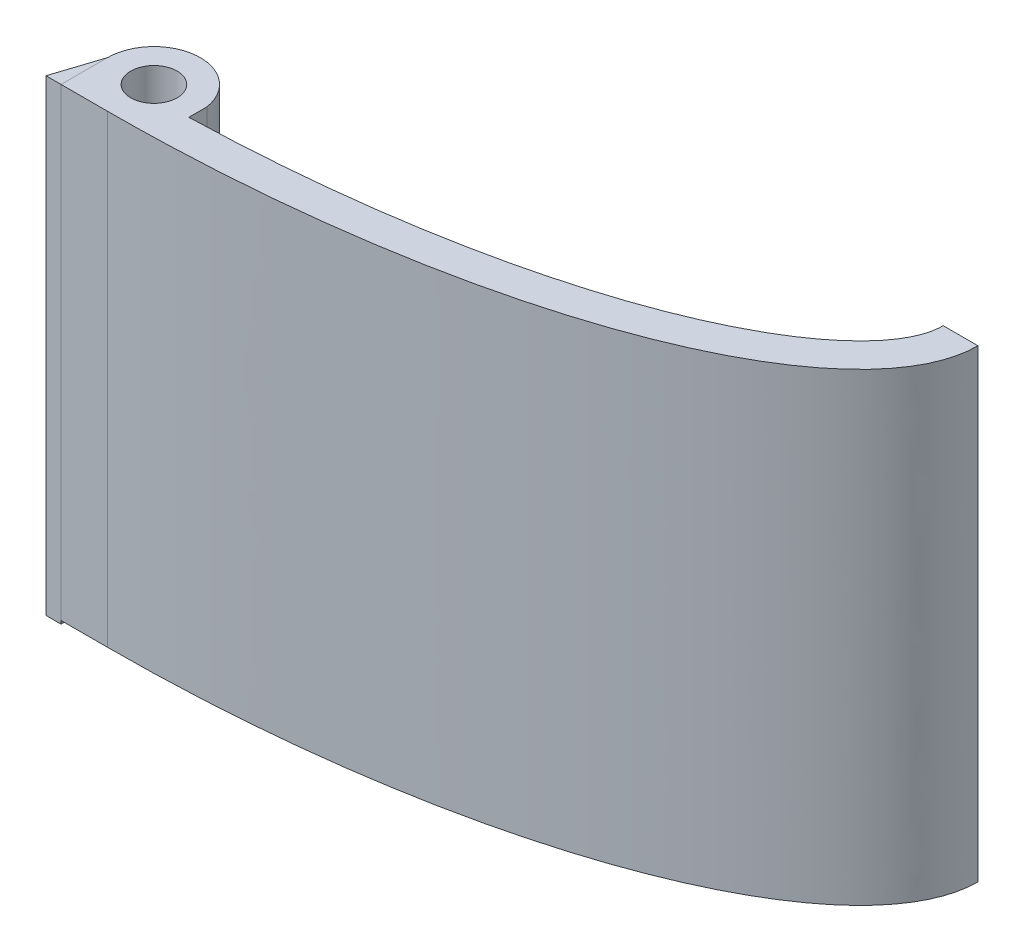
ISO-10303-21;
HEADER;
FILE_DESCRIPTION(('STEP AP214'),'2;1');
FILE_NAME('part.step','',(''),(''),'','','');
FILE_SCHEMA(('AUTOMOTIVE_DESIGN { 1 0 10303 214 1 1 1 1 }'));
ENDSEC;
DATA;
#1=APPLICATION_CONTEXT('core data for automotive mechanical design processes');
#2=APPLICATION_PROTOCOL_DEFINITION('international standard','automotive_design',2000,#1);
#3=PRODUCT_CONTEXT('',#1,'mechanical');
#4=PRODUCT('Part','Part','',(#3));
#5=PRODUCT_RELATED_PRODUCT_CATEGORY('part','',(#4));
#6=PRODUCT_DEFINITION_FORMATION('','',#4);
#7=PRODUCT_DEFINITION_CONTEXT('part definition',#1,'design');
#8=PRODUCT_DEFINITION('design','',#6,#7);
#9=PRODUCT_DEFINITION_SHAPE('','',#8);
#10=(LENGTH_UNIT() NAMED_UNIT(*) SI_UNIT(.MILLI.,.METRE.));
#11=(NAMED_UNIT(*) PLANE_ANGLE_UNIT() SI_UNIT($,.RADIAN.));
#12=(NAMED_UNIT(*) SI_UNIT($,.STERADIAN.) SOLID_ANGLE_UNIT());
#13=UNCERTAINTY_MEASURE_WITH_UNIT(LENGTH_MEASURE(1.E-05),#10,'distance_accuracy_value','');
#14=(GEOMETRIC_REPRESENTATION_CONTEXT(3) GLOBAL_UNCERTAINTY_ASSIGNED_CONTEXT((#13)) GLOBAL_UNIT_ASSIGNED_CONTEXT((#10,
#11,#12)) REPRESENTATION_CONTEXT('',''));
#15=CARTESIAN_POINT('',(0.,0.,0.));
#16=DIRECTION('',(0.,0.,1.));
#17=DIRECTION('',(1.,0.,0.));
#18=AXIS2_PLACEMENT_3D('',#15,#16,#17);
#19=CARTESIAN_POINT('',(16.,-0.275000000000004,30.));
#20=DIRECTION('',(1.,0.,0.));
#21=DIRECTION('',(0.,0.,-1.));
#22=AXIS2_PLACEMENT_3D('',#19,#20,#21);
#23=PLANE('',#22);
#24=DIRECTION('',(0.,0.,-1.));
#25=VECTOR('',#24,1.);
#26=CARTESIAN_POINT('',(16.,40.,30.));
#27=LINE('',#26,#25);
#28=CARTESIAN_POINT('',(16.,40.,30.));
#29=VERTEX_POINT('',#28);
#30=CARTESIAN_POINT('',(16.,40.,26.));
#31=VERTEX_POINT('',#30);
#32=EDGE_CURVE('E96',#29,#31,#27,.T.);
#33=ORIENTED_EDGE('',*,*,#32,.F.);
#34=DIRECTION('',(0.,1.,0.));
#35=VECTOR('',#34,1.);
#36=CARTESIAN_POINT('',(16.,-0.275000000000004,30.));
#37=LINE('',#36,#35);
#38=CARTESIAN_POINT('',(16.,-0.275000000000004,30.));
#39=VERTEX_POINT('',#38);
#40=EDGE_CURVE('E12',#39,#29,#37,.T.);
#41=ORIENTED_EDGE('',*,*,#40,.F.);
#42=DIRECTION('',(0.,0.,-1.));
#43=VECTOR('',#42,1.);
#44=CARTESIAN_POINT('',(16.,-0.275000000000004,30.));
#45=LINE('',#44,#43);
#46=CARTESIAN_POINT('',(16.,-0.275000000000004,26.));
#47=VERTEX_POINT('',#46);
#48=EDGE_CURVE('E88',#39,#47,#45,.T.);
#49=ORIENTED_EDGE('',*,*,#48,.T.);
#50=DIRECTION('',(0.,1.,0.));
#51=VECTOR('',#50,1.);
#52=CARTESIAN_POINT('',(16.,-0.275000000000004,26.));
#53=LINE('',#52,#51);
#54=EDGE_CURVE('E47',#47,#31,#53,.T.);
#55=ORIENTED_EDGE('',*,*,#54,.T.);
#56=EDGE_LOOP('',(#33,#41,#49,#55));
#57=FACE_BOUND('',#56,.T.);
#58=ADVANCED_FACE('F44',(#57),#23,.T.);
#59=CARTESIAN_POINT('',(16.,-0.275000000000004,30.));
#60=DIRECTION('',(0.,0.,1.));
#61=DIRECTION('',(1.,0.,0.));
#62=AXIS2_PLACEMENT_3D('',#59,#60,#61);
#63=PLANE('',#62);
#64=DIRECTION('',(1.,0.,0.));
#65=VECTOR('',#64,1.);
#66=CARTESIAN_POINT('',(16.,40.,30.));
#67=LINE('',#66,#65);
#68=CARTESIAN_POINT('',(14.7,40.,30.));
#69=VERTEX_POINT('',#68);
#70=EDGE_CURVE('E90',#69,#29,#67,.T.);
#71=ORIENTED_EDGE('',*,*,#70,.F.);
#72=DIRECTION('',(0.,1.,0.));
#73=VECTOR('',#72,1.);
#74=CARTESIAN_POINT('',(14.7,-0.275000000000004,30.));
#75=LINE('',#74,#73);
#76=CARTESIAN_POINT('',(14.7,-0.275000000000004,30.));
#77=VERTEX_POINT('',#76);
#78=EDGE_CURVE('E53',#77,#69,#75,.T.);
#79=ORIENTED_EDGE('',*,*,#78,.F.);
#80=DIRECTION('',(1.,0.,0.));
#81=VECTOR('',#80,1.);
#82=CARTESIAN_POINT('',(16.,-0.275000000000004,30.));
#83=LINE('',#82,#81);
#84=EDGE_CURVE('E85',#77,#39,#83,.T.);
#85=ORIENTED_EDGE('',*,*,#84,.T.);
#86=ORIENTED_EDGE('',*,*,#40,.T.);
#87=EDGE_LOOP('',(#71,#79,#85,#86));
#88=FACE_BOUND('',#87,.T.);
#89=ADVANCED_FACE('F100',(#88),#63,.T.);
#90=CARTESIAN_POINT('',(14.7,-0.275000000000004,30.));
#91=DIRECTION('',(-0.951034068730948,0.,-0.309086072337558));
#92=DIRECTION('',(-0.309086072337558,0.,0.951034068730948));
#93=AXIS2_PLACEMENT_3D('',#90,#91,#92);
#94=PLANE('',#93);
#95=DIRECTION('',(-0.309086072337558,0.,0.951034068730948));
#96=VECTOR('',#95,1.);
#97=CARTESIAN_POINT('',(14.7,40.,30.));
#98=LINE('',#97,#96);
#99=EDGE_CURVE('E83',#31,#69,#98,.T.);
#100=ORIENTED_EDGE('',*,*,#99,.F.);
#101=ORIENTED_EDGE('',*,*,#54,.F.);
#102=DIRECTION('',(-0.309086072337558,0.,0.951034068730948));
#103=VECTOR('',#102,1.);
#104=CARTESIAN_POINT('',(14.7,-0.275000000000004,30.));
#105=LINE('',#104,#103);
#106=EDGE_CURVE('E81',#47,#77,#105,.T.);
#107=ORIENTED_EDGE('',*,*,#106,.T.);
#108=ORIENTED_EDGE('',*,*,#78,.T.);
#109=EDGE_LOOP('',(#100,#101,#107,#108));
#110=FACE_BOUND('',#109,.T.);
#111=ADVANCED_FACE('F80',(#110),#94,.T.);
#112=CARTESIAN_POINT('',(0.,-0.275000000000004,0.));
#113=DIRECTION('',(0.,1.,0.));
#114=DIRECTION('',(0.,0.,1.));
#115=AXIS2_PLACEMENT_3D('',#112,#113,#114);
#116=PLANE('',#115);
#117=ORIENTED_EDGE('',*,*,#48,.F.);
#118=ORIENTED_EDGE('',*,*,#84,.F.);
#119=ORIENTED_EDGE('',*,*,#106,.F.);
#120=EDGE_LOOP('',(#117,#118,#119));
#121=FACE_BOUND('',#120,.T.);
#122=ADVANCED_FACE('F87',(#121),#116,.F.);
#123=CARTESIAN_POINT('',(0.,40.,0.));
#124=DIRECTION('',(0.,1.,0.));
#125=DIRECTION('',(0.,0.,1.));
#126=AXIS2_PLACEMENT_3D('',#123,#124,#125);
#127=PLANE('',#126);
#128=ORIENTED_EDGE('',*,*,#32,.T.);
#129=ORIENTED_EDGE('',*,*,#99,.T.);
#130=ORIENTED_EDGE('',*,*,#70,.T.);
#131=EDGE_LOOP('',(#128,#129,#130));
#132=FACE_BOUND('',#131,.T.);
#133=ADVANCED_FACE('F99',(#132),#127,.T.);
#134=CLOSED_SHELL('',(#58,#89,#111,#122,#133));
#135=MANIFOLD_SOLID_BREP('B2',#134);
#136=CARTESIAN_POINT('',(20.,-0.285000000000007,27.));
#137=CARTESIAN_POINT('',(25.15393605695,-0.285000000000007,27.));
#138=CARTESIAN_POINT('',(30.1975323268545,-0.285000000000007,26.7368136416308));
#139=CARTESIAN_POINT('',(35.1515107397377,-0.285000000000007,26.2095124751268));
#140=CARTESIAN_POINT('',(35.1738230679321,-0.285000000000007,26.2071327106288));
#141=CARTESIAN_POINT('',(35.2153941000412,-0.285000000000007,26.2026885265985));
#142=CARTESIAN_POINT('',(35.2777331713868,-0.285000000000007,26.1960095868543));
#143=CARTESIAN_POINT('',(35.423068663912,-0.285000000000007,26.1803367549963));
#144=CARTESIAN_POINT('',(35.7132502634823,-0.285000000000007,26.1486365891192));
#145=CARTESIAN_POINT('',(36.2916557378931,-0.285000000000007,26.083818686069));
#146=CARTESIAN_POINT('',(37.4406343488846,-0.285000000000007,25.9485161377419));
#147=CARTESIAN_POINT('',(39.707251145241,-0.285000000000007,25.6552731282619));
#148=CARTESIAN_POINT('',(41.5963017967152,-0.285000000000007,25.3652161814251));
#149=CARTESIAN_POINT('',(45.3026413819253,-0.285000000000007,24.7337975819237));
#150=CARTESIAN_POINT('',(47.6778365502934,-0.285000000000007,24.2444346767416));
#151=CARTESIAN_POINT('',(49.96618026701,-0.285000000000007,23.6854238211354));
#152=CARTESIAN_POINT('',(49.9791403612718,-0.285000000000007,23.6822557851479));
#153=CARTESIAN_POINT('',(50.0009935779683,-0.285000000000007,23.6769090919129));
#154=CARTESIAN_POINT('',(50.0337624641158,-0.285000000000007,23.6688855345803));
#155=CARTESIAN_POINT('',(50.1101466224485,-0.285000000000007,23.6501392837315));
#156=CARTESIAN_POINT('',(50.2626086052154,-0.285000000000007,23.6125483562067));
#157=CARTESIAN_POINT('',(50.5663069960969,-0.285000000000007,23.5369731401424));
#158=CARTESIAN_POINT('',(51.1687995637805,-0.285000000000007,23.3842520444948));
#159=CARTESIAN_POINT('',(52.3541524979884,-0.285000000000007,23.0725501494248));
#160=CARTESIAN_POINT('',(53.3364610156703,-0.285000000000007,22.7947269015489));
#161=CARTESIAN_POINT('',(55.2559929991906,-0.285000000000007,22.2251276123408));
#162=CARTESIAN_POINT('',(56.4755634499144,-0.285000000000007,21.8267759589469));
#163=CARTESIAN_POINT('',(59.9528782257426,-0.285000000000007,20.5783379629899));
#164=CARTESIAN_POINT('',(62.0289488645667,-0.285000000000007,19.6745779455732));
#165=CARTESIAN_POINT('',(63.8655392335619,-0.285000000000007,18.7072429560843));
#166=CARTESIAN_POINT('',(63.8715390787882,-0.285000000000007,18.7040815106017));
#167=CARTESIAN_POINT('',(63.8811125542092,-0.285000000000007,18.699033876098));
#168=CARTESIAN_POINT('',(63.89546629926,-0.285000000000007,18.6914618789661));
#169=CARTESIAN_POINT('',(63.9289130925846,-0.285000000000007,18.673790076228));
#170=CARTESIAN_POINT('',(63.9956255503256,-0.285000000000007,18.638431298872));
#171=CARTESIAN_POINT('',(64.1283258312012,-0.285000000000007,18.5676535865955));
#172=CARTESIAN_POINT('',(64.3908269293376,-0.285000000000007,18.4258618234274));
#173=CARTESIAN_POINT('',(64.6108542569676,-0.285000000000007,18.3039357645735));
#174=CARTESIAN_POINT('',(65.0442704072598,-0.285000000000007,18.0596052420019));
#175=CARTESIAN_POINT('',(65.3243624975748,-0.285000000000007,17.8960794879705));
#176=CARTESIAN_POINT('',(66.1380473617355,-0.285000000000007,17.4039523576473));
#177=CARTESIAN_POINT('',(66.6450309885334,-0.285000000000007,17.0737876082818));
#178=CARTESIAN_POINT('',(68.0597752546771,-0.285000000000007,16.0804789135652));
#179=CARTESIAN_POINT('',(68.8607211181235,-0.285000000000007,15.4144860522358));
#180=CARTESIAN_POINT('',(69.527711762691,-0.285000000000007,14.7529909883076));
#181=CARTESIAN_POINT('',(69.5323913442827,-0.285000000000007,14.7483462096768));
#182=CARTESIAN_POINT('',(69.5396524970483,-0.285000000000007,14.7411298773372));
#183=CARTESIAN_POINT('',(69.5505305044692,-0.285000000000007,14.7303077386776));
#184=CARTESIAN_POINT('',(69.575816499988,-0.285000000000007,14.705072659651));
#185=CARTESIAN_POINT('',(69.6260046502194,-0.285000000000007,14.6546692845492));
#186=CARTESIAN_POINT('',(69.7248476213654,-0.285000000000007,14.5541334428662));
#187=CARTESIAN_POINT('',(69.806948776203,-0.285000000000007,14.4684372666596));
#188=CARTESIAN_POINT('',(69.967677802851,-0.285000000000007,14.2977161355929));
#189=CARTESIAN_POINT('',(70.0701982631017,-0.285000000000007,14.1847971878831));
#190=CARTESIAN_POINT('',(70.3640784725089,-0.285000000000007,13.8490001801885));
#191=CARTESIAN_POINT('',(70.541734895208,-0.285000000000007,13.6290919822721));
#192=CARTESIAN_POINT('',(71.0223694031363,-0.285000000000007,12.9832180086081));
#193=CARTESIAN_POINT('',(71.2726751059899,-0.285000000000007,12.5716090379524));
#194=CARTESIAN_POINT('',(71.6546183247109,-0.285000000000007,11.7894420273645));
#195=CARTESIAN_POINT('',(71.7867798899808,-0.285000000000007,11.4192489810083));
#196=CARTESIAN_POINT('',(71.9591063251687,-0.285000000000007,10.7023598460622));
#197=CARTESIAN_POINT('',(72.,-0.285000000000007,10.3551118767143));
#198=CARTESIAN_POINT('',(72.,-0.285000000000007,9.99999999999996));
#199=B_SPLINE_CURVE_WITH_KNOTS('',3,(#136,#137,#138,#139,#140,#141,#142,#143,#144,#145,#146,
#147,#148,#149,#150,#151,#152,#153,#154,#155,#156,#157,#158,#159,#160,#161,#162,#163,#164,#165,
#166,#167,#168,#169,#170,#171,#172,#173,#174,#175,#176,#177,#178,#179,#180,#181,#182,#183,#184,
#185,#186,#187,#188,#189,#190,#191,#192,#193,#194,#195,#196,#197,#198),.UNSPECIFIED.,.F.,.F.,(4,
2,2,1,1,1,1,1,1,2,2,2,1,1,1,1,1,1,2,2,2,2,1,1,1,1,1,2,2,2,2,2,1,1,1,1,2,2,2,2,2,4),(0.,
0.250000000000003,0.250976562500003,0.251953125000003,0.253906250000003,0.257812500000004,
0.265625000000006,0.281250000000009,0.312500000000016,0.375000000000028,0.500000000000054,
0.500488281250054,0.500976562500055,0.501953125000055,0.503906250000056,0.507812500000059,
0.515625000000064,0.531250000000073,0.562500000000093,0.625000000000132,0.75000000000021,
0.75024414062521,0.75048828125021,0.75097656250021,0.751953125000209,0.753906250000208,
0.757812500000204,0.765625000000197,0.781250000000181,0.812500000000151,0.875000000000091,
0.875244140625091,0.875488281250091,0.875976562500091,0.87695312500009,0.878906250000089,
0.882812500000086,0.89062500000008,0.906250000000069,0.937500000000046,0.968750000000023,1.),.UNSPECIFIED.);
#200=DIRECTION('',(0.,1.,0.));
#201=VECTOR('',#200,1.);
#202=SURFACE_OF_LINEAR_EXTRUSION('',#199,#201);
#203=CARTESIAN_POINT('',(20.,40.,27.));
#204=CARTESIAN_POINT('',(25.15393605695,40.,27.));
#205=CARTESIAN_POINT('',(30.1975323268545,40.,26.7368136416308));
#206=CARTESIAN_POINT('',(35.1515107397377,40.,26.2095124751268));
#207=CARTESIAN_POINT('',(35.1738230679321,40.,26.2071327106288));
#208=CARTESIAN_POINT('',(35.2153941000412,40.,26.2026885265985));
#209=CARTESIAN_POINT('',(35.2777331713868,40.,26.1960095868543));
#210=CARTESIAN_POINT('',(35.423068663912,40.,26.1803367549963));
#211=CARTESIAN_POINT('',(35.7132502634823,40.,26.1486365891192));
#212=CARTESIAN_POINT('',(36.2916557378931,40.,26.083818686069));
#213=CARTESIAN_POINT('',(37.4406343488846,40.,25.9485161377419));
#214=CARTESIAN_POINT('',(39.707251145241,40.,25.6552731282619));
#215=CARTESIAN_POINT('',(41.5963017967152,40.,25.3652161814251));
#216=CARTESIAN_POINT('',(45.3026413819253,40.,24.7337975819237));
#217=CARTESIAN_POINT('',(47.6778365502934,40.,24.2444346767416));
#218=CARTESIAN_POINT('',(49.96618026701,40.,23.6854238211354));
#219=CARTESIAN_POINT('',(49.9791403612718,40.,23.6822557851479));
#220=CARTESIAN_POINT('',(50.0009935779683,40.,23.6769090919129));
#221=CARTESIAN_POINT('',(50.0337624641158,40.,23.6688855345803));
#222=CARTESIAN_POINT('',(50.1101466224485,40.,23.6501392837315));
#223=CARTESIAN_POINT('',(50.2626086052154,40.,23.6125483562067));
#224=CARTESIAN_POINT('',(50.5663069960969,40.,23.5369731401424));
#225=CARTESIAN_POINT('',(51.1687995637805,40.,23.3842520444948));
#226=CARTESIAN_POINT('',(52.3541524979884,40.,23.0725501494248));
#227=CARTESIAN_POINT('',(53.3364610156703,40.,22.7947269015489));
#228=CARTESIAN_POINT('',(55.2559929991906,40.,22.2251276123408));
#229=CARTESIAN_POINT('',(56.4755634499144,40.,21.8267759589469));
#230=CARTESIAN_POINT('',(59.9528782257426,40.,20.5783379629899));
#231=CARTESIAN_POINT('',(62.0289488645667,40.,19.6745779455732));
#232=CARTESIAN_POINT('',(63.8655392335619,40.,18.7072429560843));
#233=CARTESIAN_POINT('',(63.8715390787882,40.,18.7040815106017));
#234=CARTESIAN_POINT('',(63.8811125542092,40.,18.699033876098));
#235=CARTESIAN_POINT('',(63.89546629926,40.,18.6914618789661));
#236=CARTESIAN_POINT('',(63.9289130925846,40.,18.673790076228));
#237=CARTESIAN_POINT('',(63.9956255503256,40.,18.638431298872));
#238=CARTESIAN_POINT('',(64.1283258312012,40.,18.5676535865955));
#239=CARTESIAN_POINT('',(64.3908269293376,40.,18.4258618234274));
#240=CARTESIAN_POINT('',(64.6108542569676,40.,18.3039357645735));
#241=CARTESIAN_POINT('',(65.0442704072598,40.,18.0596052420019));
#242=CARTESIAN_POINT('',(65.3243624975748,40.,17.8960794879705));
#243=CARTESIAN_POINT('',(66.1380473617355,40.,17.4039523576473));
#244=CARTESIAN_POINT('',(66.6450309885334,40.,17.0737876082818));
#245=CARTESIAN_POINT('',(68.0597752546771,40.,16.0804789135652));
#246=CARTESIAN_POINT('',(68.8607211181235,40.,15.4144860522358));
#247=CARTESIAN_POINT('',(69.527711762691,40.,14.7529909883076));
#248=CARTESIAN_POINT('',(69.5323913442827,40.,14.7483462096768));
#249=CARTESIAN_POINT('',(69.5396524970483,40.,14.7411298773372));
#250=CARTESIAN_POINT('',(69.5505305044692,40.,14.7303077386776));
#251=CARTESIAN_POINT('',(69.575816499988,40.,14.705072659651));
#252=CARTESIAN_POINT('',(69.6260046502194,40.,14.6546692845492));
#253=CARTESIAN_POINT('',(69.7248476213654,40.,14.5541334428662));
#254=CARTESIAN_POINT('',(69.806948776203,40.,14.4684372666596));
#255=CARTESIAN_POINT('',(69.967677802851,40.,14.2977161355929));
#256=CARTESIAN_POINT('',(70.0701982631017,40.,14.1847971878831));
#257=CARTESIAN_POINT('',(70.3640784725089,40.,13.8490001801885));
#258=CARTESIAN_POINT('',(70.541734895208,40.,13.6290919822721));
#259=CARTESIAN_POINT('',(71.0223694031363,40.,12.9832180086081));
#260=CARTESIAN_POINT('',(71.2726751059899,40.,12.5716090379524));
#261=CARTESIAN_POINT('',(71.6546183247109,40.,11.7894420273645));
#262=CARTESIAN_POINT('',(71.7867798899808,40.,11.4192489810083));
#263=CARTESIAN_POINT('',(71.9591063251687,40.,10.7023598460622));
#264=CARTESIAN_POINT('',(72.,40.,10.3551118767143));
#265=CARTESIAN_POINT('',(72.,40.,9.99999999999996));
#266=B_SPLINE_CURVE_WITH_KNOTS('',3,(#203,#204,#205,#206,#207,#208,#209,#210,#211,#212,#213,
#214,#215,#216,#217,#218,#219,#220,#221,#222,#223,#224,#225,#226,#227,#228,#229,#230,#231,#232,
#233,#234,#235,#236,#237,#238,#239,#240,#241,#242,#243,#244,#245,#246,#247,#248,#249,#250,#251,
#252,#253,#254,#255,#256,#257,#258,#259,#260,#261,#262,#263,#264,#265),.UNSPECIFIED.,.F.,.F.,(4,
2,2,1,1,1,1,1,1,2,2,2,1,1,1,1,1,1,2,2,2,2,1,1,1,1,1,2,2,2,2,2,1,1,1,1,2,2,2,2,2,4),(0.,
0.250000000000003,0.250976562500003,0.251953125000003,0.253906250000003,0.257812500000004,
0.265625000000006,0.281250000000009,0.312500000000016,0.375000000000028,0.500000000000054,
0.500488281250054,0.500976562500055,0.501953125000055,0.503906250000056,0.507812500000059,
0.515625000000064,0.531250000000073,0.562500000000093,0.625000000000132,0.75000000000021,
0.75024414062521,0.75048828125021,0.75097656250021,0.751953125000209,0.753906250000208,
0.757812500000204,0.765625000000197,0.781250000000181,0.812500000000151,0.875000000000091,
0.875244140625091,0.875488281250091,0.875976562500091,0.87695312500009,0.878906250000089,
0.882812500000086,0.89062500000008,0.906250000000069,0.937500000000046,0.968750000000023,1.),.UNSPECIFIED.);
#267=CARTESIAN_POINT('',(23.9545595077892,40.,26.9477974740407));
#268=VERTEX_POINT('',#267);
#269=CARTESIAN_POINT('',(72.,40.,9.99999999999996));
#270=VERTEX_POINT('',#269);
#271=EDGE_CURVE('E285',#268,#270,#266,.T.);
#272=ORIENTED_EDGE('',*,*,#271,.T.);
#273=DIRECTION('',(0.,1.,0.));
#274=VECTOR('',#273,1.);
#275=CARTESIAN_POINT('',(72.,-0.285000000000007,9.99999999999996));
#276=LINE('',#275,#274);
#277=CARTESIAN_POINT('',(72.,0.,9.99999999999996));
#278=VERTEX_POINT('',#277);
#279=EDGE_CURVE('E228',#278,#270,#276,.T.);
#280=ORIENTED_EDGE('',*,*,#279,.F.);
#281=CARTESIAN_POINT('',(20.,0.,27.));
#282=CARTESIAN_POINT('',(25.15393605695,0.,27.));
#283=CARTESIAN_POINT('',(30.1975323268545,0.,26.7368136416308));
#284=CARTESIAN_POINT('',(35.1515107397377,0.,26.2095124751268));
#285=CARTESIAN_POINT('',(35.1738230679321,0.,26.2071327106288));
#286=CARTESIAN_POINT('',(35.2153941000412,0.,26.2026885265985));
#287=CARTESIAN_POINT('',(35.2777331713868,0.,26.1960095868543));
#288=CARTESIAN_POINT('',(35.423068663912,0.,26.1803367549963));
#289=CARTESIAN_POINT('',(35.7132502634823,0.,26.1486365891192));
#290=CARTESIAN_POINT('',(36.2916557378931,0.,26.083818686069));
#291=CARTESIAN_POINT('',(37.4406343488846,0.,25.9485161377419));
#292=CARTESIAN_POINT('',(39.707251145241,0.,25.6552731282619));
#293=CARTESIAN_POINT('',(41.5963017967152,0.,25.3652161814251));
#294=CARTESIAN_POINT('',(45.3026413819253,0.,24.7337975819237));
#295=CARTESIAN_POINT('',(47.6778365502934,0.,24.2444346767416));
#296=CARTESIAN_POINT('',(49.96618026701,0.,23.6854238211354));
#297=CARTESIAN_POINT('',(49.9791403612718,0.,23.6822557851479));
#298=CARTESIAN_POINT('',(50.0009935779683,0.,23.6769090919129));
#299=CARTESIAN_POINT('',(50.0337624641158,0.,23.6688855345803));
#300=CARTESIAN_POINT('',(50.1101466224485,0.,23.6501392837315));
#301=CARTESIAN_POINT('',(50.2626086052154,0.,23.6125483562067));
#302=CARTESIAN_POINT('',(50.5663069960969,0.,23.5369731401424));
#303=CARTESIAN_POINT('',(51.1687995637805,0.,23.3842520444948));
#304=CARTESIAN_POINT('',(52.3541524979884,0.,23.0725501494248));
#305=CARTESIAN_POINT('',(53.3364610156703,0.,22.7947269015489));
#306=CARTESIAN_POINT('',(55.2559929991906,0.,22.2251276123408));
#307=CARTESIAN_POINT('',(56.4755634499144,0.,21.8267759589469));
#308=CARTESIAN_POINT('',(59.9528782257426,0.,20.5783379629899));
#309=CARTESIAN_POINT('',(62.0289488645667,0.,19.6745779455732));
#310=CARTESIAN_POINT('',(63.8655392335619,0.,18.7072429560843));
#311=CARTESIAN_POINT('',(63.8715390787882,0.,18.7040815106017));
#312=CARTESIAN_POINT('',(63.8811125542092,0.,18.699033876098));
#313=CARTESIAN_POINT('',(63.89546629926,0.,18.6914618789661));
#314=CARTESIAN_POINT('',(63.9289130925846,0.,18.673790076228));
#315=CARTESIAN_POINT('',(63.9956255503256,0.,18.638431298872));
#316=CARTESIAN_POINT('',(64.1283258312012,0.,18.5676535865955));
#317=CARTESIAN_POINT('',(64.3908269293376,0.,18.4258618234274));
#318=CARTESIAN_POINT('',(64.6108542569676,0.,18.3039357645735));
#319=CARTESIAN_POINT('',(65.0442704072598,0.,18.0596052420019));
#320=CARTESIAN_POINT('',(65.3243624975748,0.,17.8960794879705));
#321=CARTESIAN_POINT('',(66.1380473617355,0.,17.4039523576473));
#322=CARTESIAN_POINT('',(66.6450309885334,0.,17.0737876082818));
#323=CARTESIAN_POINT('',(68.0597752546771,0.,16.0804789135652));
#324=CARTESIAN_POINT('',(68.8607211181235,0.,15.4144860522358));
#325=CARTESIAN_POINT('',(69.527711762691,0.,14.7529909883076));
#326=CARTESIAN_POINT('',(69.5323913442827,0.,14.7483462096768));
#327=CARTESIAN_POINT('',(69.5396524970483,0.,14.7411298773372));
#328=CARTESIAN_POINT('',(69.5505305044692,0.,14.7303077386776));
#329=CARTESIAN_POINT('',(69.575816499988,0.,14.705072659651));
#330=CARTESIAN_POINT('',(69.6260046502194,0.,14.6546692845492));
#331=CARTESIAN_POINT('',(69.7248476213654,0.,14.5541334428662));
#332=CARTESIAN_POINT('',(69.806948776203,0.,14.4684372666596));
#333=CARTESIAN_POINT('',(69.967677802851,0.,14.2977161355929));
#334=CARTESIAN_POINT('',(70.0701982631017,0.,14.1847971878831));
#335=CARTESIAN_POINT('',(70.3640784725089,0.,13.8490001801885));
#336=CARTESIAN_POINT('',(70.541734895208,0.,13.6290919822721));
#337=CARTESIAN_POINT('',(71.0223694031363,0.,12.9832180086081));
#338=CARTESIAN_POINT('',(71.2726751059899,0.,12.5716090379524));
#339=CARTESIAN_POINT('',(71.6546183247109,0.,11.7894420273645));
#340=CARTESIAN_POINT('',(71.7867798899808,0.,11.4192489810083));
#341=CARTESIAN_POINT('',(71.9591063251687,0.,10.7023598460622));
#342=CARTESIAN_POINT('',(72.,0.,10.3551118767143));
#343=CARTESIAN_POINT('',(72.,0.,9.99999999999996));
#344=B_SPLINE_CURVE_WITH_KNOTS('',3,(#281,#282,#283,#284,#285,#286,#287,#288,#289,#290,#291,
#292,#293,#294,#295,#296,#297,#298,#299,#300,#301,#302,#303,#304,#305,#306,#307,#308,#309,#310,
#311,#312,#313,#314,#315,#316,#317,#318,#319,#320,#321,#322,#323,#324,#325,#326,#327,#328,#329,
#330,#331,#332,#333,#334,#335,#336,#337,#338,#339,#340,#341,#342,#343),.UNSPECIFIED.,.F.,.F.,(4,
2,2,1,1,1,1,1,1,2,2,2,1,1,1,1,1,1,2,2,2,2,1,1,1,1,1,2,2,2,2,2,1,1,1,1,2,2,2,2,2,4),(0.,
0.250000000000003,0.250976562500003,0.251953125000003,0.253906250000003,0.257812500000004,
0.265625000000006,0.281250000000009,0.312500000000016,0.375000000000028,0.500000000000054,
0.500488281250054,0.500976562500055,0.501953125000055,0.503906250000056,0.507812500000059,
0.515625000000064,0.531250000000073,0.562500000000093,0.625000000000132,0.75000000000021,
0.75024414062521,0.75048828125021,0.75097656250021,0.751953125000209,0.753906250000208,
0.757812500000204,0.765625000000197,0.781250000000181,0.812500000000151,0.875000000000091,
0.875244140625091,0.875488281250091,0.875976562500091,0.87695312500009,0.878906250000089,
0.882812500000086,0.89062500000008,0.906250000000069,0.937500000000046,0.968750000000023,1.),.UNSPECIFIED.);
#345=CARTESIAN_POINT('',(23.9545595077892,0.,26.9477974740407));
#346=VERTEX_POINT('',#345);
#347=EDGE_CURVE('E212',#346,#278,#344,.T.);
#348=ORIENTED_EDGE('',*,*,#347,.F.);
#349=DIRECTION('',(0.,1.,0.));
#350=VECTOR('',#349,1.);
#351=CARTESIAN_POINT('',(23.9545595077892,-0.285000000000007,26.9477974740407));
#352=LINE('',#351,#350);
#353=EDGE_CURVE('E302',#346,#268,#352,.T.);
#354=ORIENTED_EDGE('',*,*,#353,.T.);
#355=EDGE_LOOP('',(#272,#280,#348,#354));
#356=FACE_BOUND('',#355,.T.);
#357=ADVANCED_FACE('F141',(#356),#202,.F.);
#358=CARTESIAN_POINT('',(16.,-0.285000000000007,26.));
#359=DIRECTION('',(1.,0.,0.));
#360=DIRECTION('',(0.,0.,-1.));
#361=AXIS2_PLACEMENT_3D('',#358,#359,#360);
#362=PLANE('',#361);
#363=DIRECTION('',(0.,0.,-1.));
#364=VECTOR('',#363,1.);
#365=CARTESIAN_POINT('',(16.,40.,0.));
#366=LINE('',#365,#364);
#367=CARTESIAN_POINT('',(16.,40.,30.));
#368=VERTEX_POINT('',#367);
#369=CARTESIAN_POINT('',(16.,40.,26.));
#370=VERTEX_POINT('',#369);
#371=EDGE_CURVE('E289',#368,#370,#366,.T.);
#372=ORIENTED_EDGE('',*,*,#371,.T.);
#373=DIRECTION('',(0.,1.,0.));
#374=VECTOR('',#373,1.);
#375=CARTESIAN_POINT('',(16.,-0.285000000000007,26.));
#376=LINE('',#375,#374);
#377=CARTESIAN_POINT('',(16.,0.,26.));
#378=VERTEX_POINT('',#377);
#379=EDGE_CURVE('E299',#378,#370,#376,.T.);
#380=ORIENTED_EDGE('',*,*,#379,.F.);
#381=DIRECTION('',(0.,0.,-1.));
#382=VECTOR('',#381,1.);
#383=CARTESIAN_POINT('',(16.,0.,0.));
#384=LINE('',#383,#382);
#385=CARTESIAN_POINT('',(16.,0.,30.));
#386=VERTEX_POINT('',#385);
#387=EDGE_CURVE('E276',#386,#378,#384,.T.);
#388=ORIENTED_EDGE('',*,*,#387,.F.);
#389=DIRECTION('',(0.,-1.,0.));
#390=VECTOR('',#389,1.);
#391=CARTESIAN_POINT('',(16.,40.,30.));
#392=LINE('',#391,#390);
#393=EDGE_CURVE('E216',#368,#386,#392,.T.);
#394=ORIENTED_EDGE('',*,*,#393,.F.);
#395=EDGE_LOOP('',(#372,#380,#388,#394));
#396=FACE_BOUND('',#395,.T.);
#397=ADVANCED_FACE('F329',(#396),#362,.F.);
#398=CARTESIAN_POINT('',(20.,-0.285000000000007,26.));
#399=DIRECTION('',(0.,1.,0.));
#400=DIRECTION('',(0.,0.,1.));
#401=AXIS2_PLACEMENT_3D('',#398,#399,#400);
#402=CYLINDRICAL_SURFACE('',#401,4.00000000000001);
#403=CARTESIAN_POINT('',(20.,40.,26.));
#404=DIRECTION('',(0.,1.,0.));
#405=DIRECTION('',(0.,0.,1.));
#406=AXIS2_PLACEMENT_3D('',#403,#404,#405);
#407=CIRCLE('',#406,4.00000000000001);
#408=CARTESIAN_POINT('',(23.9545595077892,40.,25.3987853134245));
#409=VERTEX_POINT('',#408);
#410=EDGE_CURVE('E294',#370,#409,#407,.F.);
#411=ORIENTED_EDGE('',*,*,#410,.T.);
#412=DIRECTION('',(0.,1.,0.));
#413=VECTOR('',#412,1.);
#414=CARTESIAN_POINT('',(23.9545595077892,-0.285000000000007,25.3987853134245));
#415=LINE('',#414,#413);
#416=CARTESIAN_POINT('',(23.9545595077892,0.,25.3987853134245));
#417=VERTEX_POINT('',#416);
#418=EDGE_CURVE('E305',#417,#409,#415,.T.);
#419=ORIENTED_EDGE('',*,*,#418,.F.);
#420=CARTESIAN_POINT('',(20.,0.,26.));
#421=DIRECTION('',(0.,1.,0.));
#422=DIRECTION('',(0.,0.,1.));
#423=AXIS2_PLACEMENT_3D('',#420,#421,#422);
#424=CIRCLE('',#423,4.00000000000001);
#425=EDGE_CURVE('E274',#378,#417,#424,.F.);
#426=ORIENTED_EDGE('',*,*,#425,.F.);
#427=ORIENTED_EDGE('',*,*,#379,.T.);
#428=EDGE_LOOP('',(#411,#419,#426,#427));
#429=FACE_BOUND('',#428,.T.);
#430=ADVANCED_FACE('F326',(#429),#402,.T.);
#431=CARTESIAN_POINT('',(23.9545595077892,-0.285000000000007,26.9477974740407));
#432=DIRECTION('',(-1.,0.,0.));
#433=DIRECTION('',(0.,0.,1.));
#434=AXIS2_PLACEMENT_3D('',#431,#432,#433);
#435=PLANE('',#434);
#436=DIRECTION('',(0.,0.,1.));
#437=VECTOR('',#436,1.);
#438=CARTESIAN_POINT('',(23.9545595077892,40.,0.));
#439=LINE('',#438,#437);
#440=EDGE_CURVE('E227',#409,#268,#439,.T.);
#441=ORIENTED_EDGE('',*,*,#440,.T.);
#442=ORIENTED_EDGE('',*,*,#353,.F.);
#443=DIRECTION('',(0.,0.,1.));
#444=VECTOR('',#443,1.);
#445=CARTESIAN_POINT('',(23.9545595077892,0.,0.));
#446=LINE('',#445,#444);
#447=EDGE_CURVE('E271',#417,#346,#446,.T.);
#448=ORIENTED_EDGE('',*,*,#447,.F.);
#449=ORIENTED_EDGE('',*,*,#418,.T.);
#450=EDGE_LOOP('',(#441,#442,#448,#449));
#451=FACE_BOUND('',#450,.T.);
#452=ADVANCED_FACE('F325',(#451),#435,.F.);
#453=CARTESIAN_POINT('',(72.,-0.285000000000007,9.99999999999996));
#454=DIRECTION('',(0.,0.,1.));
#455=DIRECTION('',(1.,0.,0.));
#456=AXIS2_PLACEMENT_3D('',#453,#454,#455);
#457=PLANE('',#456);
#458=DIRECTION('',(1.,0.,0.));
#459=VECTOR('',#458,1.);
#460=CARTESIAN_POINT('',(0.,40.,10.0000000000002));
#461=LINE('',#460,#459);
#462=CARTESIAN_POINT('',(75.,40.,10.));
#463=VERTEX_POINT('',#462);
#464=EDGE_CURVE('E223',#270,#463,#461,.T.);
#465=ORIENTED_EDGE('',*,*,#464,.T.);
#466=CARTESIAN_POINT('',(75.,-2.,10.));
#467=CARTESIAN_POINT('',(75.,12.6666666666667,10.));
#468=CARTESIAN_POINT('',(75.,27.3333333333333,10.));
#469=CARTESIAN_POINT('',(75.,42.,10.));
#470=(BOUNDED_CURVE() B_SPLINE_CURVE(3,(#466,#467,#468,#469),.UNSPECIFIED.,.F.,
.F.) B_SPLINE_CURVE_WITH_KNOTS((4,4),(-0.002,0.042),
.UNSPECIFIED.) CURVE() GEOMETRIC_REPRESENTATION_ITEM() RATIONAL_B_SPLINE_CURVE((1.,1.,1.,1.)) REPRESENTATION_ITEM(''));
#471=CARTESIAN_POINT('',(75.,0.,10.));
#472=VERTEX_POINT('',#471);
#473=EDGE_CURVE('E219',#463,#472,#470,.F.);
#474=ORIENTED_EDGE('',*,*,#473,.T.);
#475=DIRECTION('',(1.,0.,0.));
#476=VECTOR('',#475,1.);
#477=CARTESIAN_POINT('',(0.,0.,10.0000000000002));
#478=LINE('',#477,#476);
#479=EDGE_CURVE('E204',#278,#472,#478,.T.);
#480=ORIENTED_EDGE('',*,*,#479,.F.);
#481=ORIENTED_EDGE('',*,*,#279,.T.);
#482=EDGE_LOOP('',(#465,#474,#480,#481));
#483=FACE_BOUND('',#482,.T.);
#484=ADVANCED_FACE('F221',(#483),#457,.F.);
#485=CARTESIAN_POINT('',(0.,0.,0.));
#486=DIRECTION('',(0.,1.,0.));
#487=DIRECTION('',(0.,0.,1.));
#488=AXIS2_PLACEMENT_3D('',#485,#486,#487);
#489=PLANE('',#488);
#490=CARTESIAN_POINT('',(20.,0.,26.));
#491=DIRECTION('',(0.,1.,0.));
#492=DIRECTION('',(0.,0.,1.));
#493=AXIS2_PLACEMENT_3D('',#490,#491,#492);
#494=CIRCLE('',#493,2.);
#495=CARTESIAN_POINT('',(20.,0.,28.));
#496=VERTEX_POINT('',#495);
#497=EDGE_CURVE('E307',#496,#496,#494,.T.);
#498=ORIENTED_EDGE('',*,*,#497,.T.);
#499=EDGE_LOOP('',(#498));
#500=FACE_BOUND('',#499,.T.);
#501=ORIENTED_EDGE('',*,*,#347,.T.);
#502=ORIENTED_EDGE('',*,*,#479,.T.);
#503=CARTESIAN_POINT('',(20.,0.,30.));
#504=CARTESIAN_POINT('',(75.,0.,30.));
#505=CARTESIAN_POINT('',(75.,0.,10.));
#506=(BOUNDED_CURVE() B_SPLINE_CURVE(2,(#503,#504,#505),.UNSPECIFIED.,.F.,
.F.) B_SPLINE_CURVE_WITH_KNOTS((3,3),(0.,1.),
.UNSPECIFIED.) CURVE() GEOMETRIC_REPRESENTATION_ITEM() RATIONAL_B_SPLINE_CURVE((1.,
0.707106781186548,1.)) REPRESENTATION_ITEM(''));
#507=CARTESIAN_POINT('',(20.,0.,30.));
#508=VERTEX_POINT('',#507);
#509=EDGE_CURVE('E208',#472,#508,#506,.F.);
#510=ORIENTED_EDGE('',*,*,#509,.T.);
#511=DIRECTION('',(1.,0.,0.));
#512=VECTOR('',#511,1.);
#513=CARTESIAN_POINT('',(-75.,0.,30.));
#514=LINE('',#513,#512);
#515=EDGE_CURVE('E42',#386,#508,#514,.T.);
#516=ORIENTED_EDGE('',*,*,#515,.F.);
#517=ORIENTED_EDGE('',*,*,#387,.T.);
#518=ORIENTED_EDGE('',*,*,#425,.T.);
#519=ORIENTED_EDGE('',*,*,#447,.T.);
#520=EDGE_LOOP('',(#501,#502,#510,#516,#517,#518,#519));
#521=FACE_BOUND('',#520,.T.);
#522=ADVANCED_FACE('F206',(#500,#521),#489,.F.);
#523=CARTESIAN_POINT('',(-75.,40.,30.));
#524=DIRECTION('',(0.,0.,-1.));
#525=DIRECTION('',(-1.,0.,0.));
#526=AXIS2_PLACEMENT_3D('',#523,#524,#525);
#527=PLANE('',#526);
#528=DIRECTION('',(1.,0.,0.));
#529=VECTOR('',#528,1.);
#530=CARTESIAN_POINT('',(-75.,40.,30.));
#531=LINE('',#530,#529);
#532=CARTESIAN_POINT('',(20.,40.,30.));
#533=VERTEX_POINT('',#532);
#534=EDGE_CURVE('E154',#368,#533,#531,.T.);
#535=ORIENTED_EDGE('',*,*,#534,.F.);
#536=ORIENTED_EDGE('',*,*,#393,.T.);
#537=ORIENTED_EDGE('',*,*,#515,.T.);
#538=CARTESIAN_POINT('',(20.,42.,30.));
#539=CARTESIAN_POINT('',(20.,27.3333333333333,30.));
#540=CARTESIAN_POINT('',(20.,12.6666666666667,30.));
#541=CARTESIAN_POINT('',(20.,-2.,30.));
#542=(BOUNDED_CURVE() B_SPLINE_CURVE(3,(#538,#539,#540,#541),.UNSPECIFIED.,.F.,
.F.) B_SPLINE_CURVE_WITH_KNOTS((4,4),(-0.002,0.042),
.UNSPECIFIED.) CURVE() GEOMETRIC_REPRESENTATION_ITEM() RATIONAL_B_SPLINE_CURVE((1.,1.,1.,1.)) REPRESENTATION_ITEM(''));
#543=EDGE_CURVE('E233',#508,#533,#542,.F.);
#544=ORIENTED_EDGE('',*,*,#543,.T.);
#545=EDGE_LOOP('',(#535,#536,#537,#544));
#546=FACE_BOUND('',#545,.T.);
#547=ADVANCED_FACE('F252',(#546),#527,.F.);
#548=CARTESIAN_POINT('',(0.,40.,0.));
#549=DIRECTION('',(0.,1.,0.));
#550=DIRECTION('',(0.,0.,1.));
#551=AXIS2_PLACEMENT_3D('',#548,#549,#550);
#552=PLANE('',#551);
#553=CARTESIAN_POINT('',(20.,40.,26.));
#554=DIRECTION('',(0.,1.,0.));
#555=DIRECTION('',(0.,0.,1.));
#556=AXIS2_PLACEMENT_3D('',#553,#554,#555);
#557=CIRCLE('',#556,2.);
#558=CARTESIAN_POINT('',(20.,40.,28.));
#559=VERTEX_POINT('',#558);
#560=EDGE_CURVE('E444',#559,#559,#557,.T.);
#561=ORIENTED_EDGE('',*,*,#560,.F.);
#562=EDGE_LOOP('',(#561));
#563=FACE_BOUND('',#562,.T.);
#564=ORIENTED_EDGE('',*,*,#464,.F.);
#565=ORIENTED_EDGE('',*,*,#271,.F.);
#566=ORIENTED_EDGE('',*,*,#440,.F.);
#567=ORIENTED_EDGE('',*,*,#410,.F.);
#568=ORIENTED_EDGE('',*,*,#371,.F.);
#569=ORIENTED_EDGE('',*,*,#534,.T.);
#570=CARTESIAN_POINT('',(75.,40.,10.));
#571=CARTESIAN_POINT('',(75.,40.,30.));
#572=CARTESIAN_POINT('',(20.,40.,30.));
#573=(BOUNDED_CURVE() B_SPLINE_CURVE(2,(#570,#571,#572),.UNSPECIFIED.,.F.,
.F.) B_SPLINE_CURVE_WITH_KNOTS((3,3),(0.,1.),
.UNSPECIFIED.) CURVE() GEOMETRIC_REPRESENTATION_ITEM() RATIONAL_B_SPLINE_CURVE((1.,
0.707106781186548,1.)) REPRESENTATION_ITEM(''));
#574=EDGE_CURVE('E273',#533,#463,#573,.F.);
#575=ORIENTED_EDGE('',*,*,#574,.T.);
#576=EDGE_LOOP('',(#564,#565,#566,#567,#568,#569,#575));
#577=FACE_BOUND('',#576,.T.);
#578=ADVANCED_FACE('F243',(#563,#577),#552,.T.);
#579=CARTESIAN_POINT('',(75.,42.,10.));
#580=CARTESIAN_POINT('',(75.,27.3333333333333,10.));
#581=CARTESIAN_POINT('',(75.,12.6666666666667,10.));
#582=CARTESIAN_POINT('',(75.,-2.,10.));
#583=CARTESIAN_POINT('',(75.,42.,30.));
#584=CARTESIAN_POINT('',(75.,27.3333333333333,30.));
#585=CARTESIAN_POINT('',(75.,12.6666666666667,30.));
#586=CARTESIAN_POINT('',(75.,-2.,30.));
#587=CARTESIAN_POINT('',(20.,42.,30.));
#588=CARTESIAN_POINT('',(20.,27.3333333333333,30.));
#589=CARTESIAN_POINT('',(20.,12.6666666666667,30.));
#590=CARTESIAN_POINT('',(20.,-2.,30.));
#591=(BOUNDED_SURFACE() B_SPLINE_SURFACE(2,3,((#579,#580,#581,#582),(#583,#584,#585,#586),(#587,
#588,#589,#590)),.UNSPECIFIED.,.F.,.F.,.F.) B_SPLINE_SURFACE_WITH_KNOTS((3,3),(4,4),(0.,1.),
(-0.002,0.042),.UNSPECIFIED.) GEOMETRIC_REPRESENTATION_ITEM() RATIONAL_B_SPLINE_SURFACE(((1.,1.,
1.,1.),(0.707106781186548,0.707106781186548,0.707106781186548,0.707106781186548),(1.,1.,1.,1.))) REPRESENTATION_ITEM('') SURFACE());
#592=ORIENTED_EDGE('',*,*,#574,.F.);
#593=ORIENTED_EDGE('',*,*,#543,.F.);
#594=ORIENTED_EDGE('',*,*,#509,.F.);
#595=ORIENTED_EDGE('',*,*,#473,.F.);
#596=EDGE_LOOP('',(#592,#593,#594,#595));
#597=FACE_BOUND('',#596,.T.);
#598=ADVANCED_FACE('F144',(#597),#591,.T.);
#599=CARTESIAN_POINT('',(20.,-0.275000000000004,26.));
#600=DIRECTION('',(0.,1.,0.));
#601=DIRECTION('',(0.,0.,1.));
#602=AXIS2_PLACEMENT_3D('',#599,#600,#601);
#603=CYLINDRICAL_SURFACE('',#602,2.);
#604=CARTESIAN_POINT('',(20.,40.,28.));
#605=CARTESIAN_POINT('',(20.,39.5833333333333,28.));
#606=CARTESIAN_POINT('',(20.,39.1666666666667,28.));
#607=CARTESIAN_POINT('',(20.,38.3333333333333,28.));
#608=CARTESIAN_POINT('',(20.,37.9166666666667,28.));
#609=CARTESIAN_POINT('',(20.,37.0833333333333,28.));
#610=CARTESIAN_POINT('',(20.,36.6666666666667,28.));
#611=CARTESIAN_POINT('',(20.,35.8333333333333,28.));
#612=CARTESIAN_POINT('',(20.,35.4166666666667,28.));
#613=CARTESIAN_POINT('',(20.,34.5833333333333,28.));
#614=CARTESIAN_POINT('',(20.,34.1666666666667,28.));
#615=CARTESIAN_POINT('',(20.,33.3333333333333,28.));
#616=CARTESIAN_POINT('',(20.,32.9166666666667,28.));
#617=CARTESIAN_POINT('',(20.,32.0833333333333,28.));
#618=CARTESIAN_POINT('',(20.,31.6666666666667,28.));
#619=CARTESIAN_POINT('',(20.,30.8333333333333,28.));
#620=CARTESIAN_POINT('',(20.,30.4166666666667,28.));
#621=CARTESIAN_POINT('',(20.,29.5833333333333,28.));
#622=CARTESIAN_POINT('',(20.,29.1666666666667,28.));
#623=CARTESIAN_POINT('',(20.,28.3333333333333,28.));
#624=CARTESIAN_POINT('',(20.,27.9166666666667,28.));
#625=CARTESIAN_POINT('',(20.,27.0833333333333,28.));
#626=CARTESIAN_POINT('',(20.,26.6666666666667,28.));
#627=CARTESIAN_POINT('',(20.,25.8333333333333,28.));
#628=CARTESIAN_POINT('',(20.,25.4166666666667,28.));
#629=CARTESIAN_POINT('',(20.,24.5833333333333,28.));
#630=CARTESIAN_POINT('',(20.,24.1666666666667,28.));
#631=CARTESIAN_POINT('',(20.,23.3333333333333,28.));
#632=CARTESIAN_POINT('',(20.,22.9166666666667,28.));
#633=CARTESIAN_POINT('',(20.,22.0833333333333,28.));
#634=CARTESIAN_POINT('',(20.,21.6666666666667,28.));
#635=CARTESIAN_POINT('',(20.,20.8333333333333,28.));
#636=CARTESIAN_POINT('',(20.,20.4166666666667,28.));
#637=CARTESIAN_POINT('',(20.,19.5833333333333,28.));
#638=CARTESIAN_POINT('',(20.,19.1666666666667,28.));
#639=CARTESIAN_POINT('',(20.,18.3333333333333,28.));
#640=CARTESIAN_POINT('',(20.,17.9166666666667,28.));
#641=CARTESIAN_POINT('',(20.,17.0833333333333,28.));
#642=CARTESIAN_POINT('',(20.,16.6666666666667,28.));
#643=CARTESIAN_POINT('',(20.,15.8333333333333,28.));
#644=CARTESIAN_POINT('',(20.,15.4166666666667,28.));
#645=CARTESIAN_POINT('',(20.,14.5833333333333,28.));
#646=CARTESIAN_POINT('',(20.,14.1666666666667,28.));
#647=CARTESIAN_POINT('',(20.,13.3333333333333,28.));
#648=CARTESIAN_POINT('',(20.,12.9166666666667,28.));
#649=CARTESIAN_POINT('',(20.,12.0833333333333,28.));
#650=CARTESIAN_POINT('',(20.,11.6666666666667,28.));
#651=CARTESIAN_POINT('',(20.,10.8333333333333,28.));
#652=CARTESIAN_POINT('',(20.,10.4166666666667,28.));
#653=CARTESIAN_POINT('',(20.,9.58333333333333,28.));
#654=CARTESIAN_POINT('',(20.,9.16666666666667,28.));
#655=CARTESIAN_POINT('',(20.,8.33333333333333,28.));
#656=CARTESIAN_POINT('',(20.,7.91666666666667,28.));
#657=CARTESIAN_POINT('',(20.,7.08333333333333,28.));
#658=CARTESIAN_POINT('',(20.,6.66666666666666,28.));
#659=CARTESIAN_POINT('',(20.,5.83333333333333,28.));
#660=CARTESIAN_POINT('',(20.,5.41666666666666,28.));
#661=CARTESIAN_POINT('',(20.,4.58333333333333,28.));
#662=CARTESIAN_POINT('',(20.,4.16666666666667,28.));
#663=CARTESIAN_POINT('',(20.,3.33333333333334,28.));
#664=CARTESIAN_POINT('',(20.,2.91666666666667,28.));
#665=CARTESIAN_POINT('',(20.,2.08333333333334,28.));
#666=CARTESIAN_POINT('',(20.,1.66666666666667,28.));
#667=CARTESIAN_POINT('',(20.,0.833333333333334,28.));
#668=CARTESIAN_POINT('',(20.,0.416666666666667,28.));
#669=CARTESIAN_POINT('',(20.,0.,28.));
#670=B_SPLINE_CURVE_WITH_KNOTS('',3,(#604,#605,#606,#607,#608,#609,#610,#611,#612,#613,#614,
#615,#616,#617,#618,#619,#620,#621,#622,#623,#624,#625,#626,#627,#628,#629,#630,#631,#632,#633,
#634,#635,#636,#637,#638,#639,#640,#641,#642,#643,#644,#645,#646,#647,#648,#649,#650,#651,#652,
#653,#654,#655,#656,#657,#658,#659,#660,#661,#662,#663,#664,#665,#666,#667,#668,#669),
.UNSPECIFIED.,.F.,.F.,(4,2,2,2,2,2,2,2,2,2,2,2,2,2,2,2,2,2,2,2,2,2,2,2,2,2,2,2,2,2,2,2,4),(0.,
1.25,2.5,3.75,5.,6.25,7.5,8.75,10.,11.25,12.5,13.75,15.,16.25,17.5,18.75,20.,21.25,22.5,23.75,
25.,26.25,27.5,28.75,30.,31.25,32.5,33.75,35.,36.25,37.5,38.75,40.),.UNSPECIFIED.);
#671=EDGE_CURVE('BSEAM258',#559,#496,#670,.T.);
#672=ORIENTED_EDGE('',*,*,#560,.T.);
#673=ORIENTED_EDGE('',*,*,#497,.F.);
#674=ORIENTED_EDGE('',*,*,#671,.T.);
#675=ORIENTED_EDGE('',*,*,#671,.F.);
#676=EDGE_LOOP('',(#672,#674,#673,#675));
#677=FACE_BOUND('',#676,.T.);
#678=ADVANCED_FACE('F258',(#677),#603,.F.);
#679=CLOSED_SHELL('',(#357,#397,#430,#452,#484,#522,#547,#578,#598,#678));
#680=MANIFOLD_SOLID_BREP('B6',#679);
#681=ADVANCED_BREP_SHAPE_REPRESENTATION('',(#18,#135,#680),#14);
#682=SHAPE_DEFINITION_REPRESENTATION(#9,#681);
ENDSEC;
END-ISO-10303-21;
